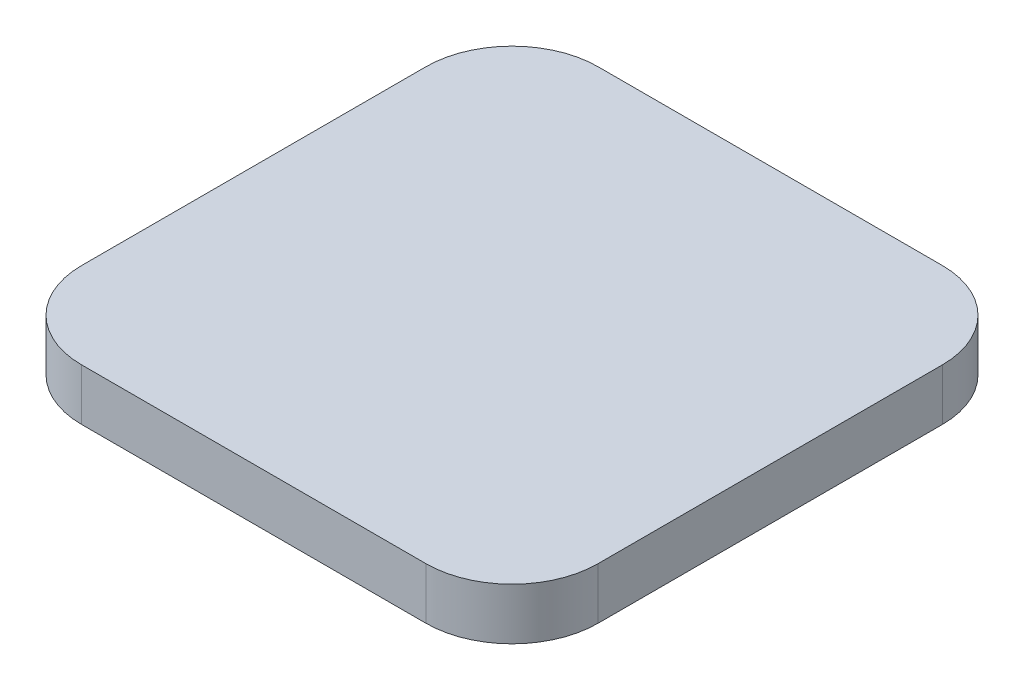
ISO-10303-21;
HEADER;
FILE_DESCRIPTION(('STEP AP214'),'2;1');
FILE_NAME('part.step','',(''),(''),'','','');
FILE_SCHEMA(('AUTOMOTIVE_DESIGN { 1 0 10303 214 1 1 1 1 }'));
ENDSEC;
DATA;
#1=APPLICATION_CONTEXT('core data for automotive mechanical design processes');
#2=APPLICATION_PROTOCOL_DEFINITION('international standard','automotive_design',2000,#1);
#3=PRODUCT_CONTEXT('',#1,'mechanical');
#4=PRODUCT('Part','Part','',(#3));
#5=PRODUCT_RELATED_PRODUCT_CATEGORY('part','',(#4));
#6=PRODUCT_DEFINITION_FORMATION('','',#4);
#7=PRODUCT_DEFINITION_CONTEXT('part definition',#1,'design');
#8=PRODUCT_DEFINITION('design','',#6,#7);
#9=PRODUCT_DEFINITION_SHAPE('','',#8);
#10=(LENGTH_UNIT() NAMED_UNIT(*) SI_UNIT(.MILLI.,.METRE.));
#11=(NAMED_UNIT(*) PLANE_ANGLE_UNIT() SI_UNIT($,.RADIAN.));
#12=(NAMED_UNIT(*) SI_UNIT($,.STERADIAN.) SOLID_ANGLE_UNIT());
#13=UNCERTAINTY_MEASURE_WITH_UNIT(LENGTH_MEASURE(1.E-05),#10,'distance_accuracy_value','');
#14=(GEOMETRIC_REPRESENTATION_CONTEXT(3) GLOBAL_UNCERTAINTY_ASSIGNED_CONTEXT((#13)) GLOBAL_UNIT_ASSIGNED_CONTEXT((#10,
#11,#12)) REPRESENTATION_CONTEXT('',''));
#15=CARTESIAN_POINT('',(0.,0.,0.));
#16=DIRECTION('',(0.,0.,1.));
#17=DIRECTION('',(1.,0.,0.));
#18=AXIS2_PLACEMENT_3D('',#15,#16,#17);
#19=CARTESIAN_POINT('',(-9.99999999999999,3.,10.));
#20=DIRECTION('',(0.,-1.,0.));
#21=DIRECTION('',(0.,0.,-1.));
#22=AXIS2_PLACEMENT_3D('',#19,#20,#21);
#23=CYLINDRICAL_SURFACE('',#22,5.);
#24=CARTESIAN_POINT('',(-9.99999999999999,0.,10.));
#25=DIRECTION('',(0.,1.,0.));
#26=DIRECTION('',(0.,0.,-1.));
#27=AXIS2_PLACEMENT_3D('',#24,#25,#26);
#28=CIRCLE('',#27,5.);
#29=CARTESIAN_POINT('',(-15.,0.,10.));
#30=VERTEX_POINT('',#29);
#31=CARTESIAN_POINT('',(-9.99999999999999,0.,15.));
#32=VERTEX_POINT('',#31);
#33=EDGE_CURVE('E135',#30,#32,#28,.T.);
#34=ORIENTED_EDGE('',*,*,#33,.T.);
#35=DIRECTION('',(0.,-1.,0.));
#36=VECTOR('',#35,1.);
#37=CARTESIAN_POINT('',(-9.99999999999999,3.,15.));
#38=LINE('',#37,#36);
#39=CARTESIAN_POINT('',(-9.99999999999999,3.,15.));
#40=VERTEX_POINT('',#39);
#41=EDGE_CURVE('E11',#40,#32,#38,.T.);
#42=ORIENTED_EDGE('',*,*,#41,.F.);
#43=CARTESIAN_POINT('',(-9.99999999999999,3.,10.));
#44=DIRECTION('',(0.,1.,0.));
#45=DIRECTION('',(0.,0.,-1.));
#46=AXIS2_PLACEMENT_3D('',#43,#44,#45);
#47=CIRCLE('',#46,5.);
#48=CARTESIAN_POINT('',(-15.,3.,10.));
#49=VERTEX_POINT('',#48);
#50=EDGE_CURVE('E149',#49,#40,#47,.T.);
#51=ORIENTED_EDGE('',*,*,#50,.F.);
#52=DIRECTION('',(0.,-1.,0.));
#53=VECTOR('',#52,1.);
#54=CARTESIAN_POINT('',(-15.,3.,10.));
#55=LINE('',#54,#53);
#56=EDGE_CURVE('E131',#49,#30,#55,.T.);
#57=ORIENTED_EDGE('',*,*,#56,.T.);
#58=EDGE_LOOP('',(#34,#42,#51,#57));
#59=FACE_BOUND('',#58,.T.);
#60=ADVANCED_FACE('F39',(#59),#23,.T.);
#61=CARTESIAN_POINT('',(-9.99999999999999,3.,15.));
#62=DIRECTION('',(0.,0.,-1.));
#63=DIRECTION('',(-1.,0.,0.));
#64=AXIS2_PLACEMENT_3D('',#61,#62,#63);
#65=PLANE('',#64);
#66=DIRECTION('',(1.,0.,0.));
#67=VECTOR('',#66,1.);
#68=CARTESIAN_POINT('',(-9.99999999999999,0.,15.));
#69=LINE('',#68,#67);
#70=CARTESIAN_POINT('',(10.,0.,15.));
#71=VERTEX_POINT('',#70);
#72=EDGE_CURVE('E138',#32,#71,#69,.T.);
#73=ORIENTED_EDGE('',*,*,#72,.T.);
#74=DIRECTION('',(0.,-1.,0.));
#75=VECTOR('',#74,1.);
#76=CARTESIAN_POINT('',(10.,3.,15.));
#77=LINE('',#76,#75);
#78=CARTESIAN_POINT('',(10.,3.,15.));
#79=VERTEX_POINT('',#78);
#80=EDGE_CURVE('E47',#79,#71,#77,.T.);
#81=ORIENTED_EDGE('',*,*,#80,.F.);
#82=DIRECTION('',(1.,0.,0.));
#83=VECTOR('',#82,1.);
#84=CARTESIAN_POINT('',(-9.99999999999999,3.,15.));
#85=LINE('',#84,#83);
#86=EDGE_CURVE('E98',#40,#79,#85,.T.);
#87=ORIENTED_EDGE('',*,*,#86,.F.);
#88=ORIENTED_EDGE('',*,*,#41,.T.);
#89=EDGE_LOOP('',(#73,#81,#87,#88));
#90=FACE_BOUND('',#89,.T.);
#91=ADVANCED_FACE('F184',(#90),#65,.F.);
#92=CARTESIAN_POINT('',(10.,3.,10.));
#93=DIRECTION('',(0.,-1.,0.));
#94=DIRECTION('',(0.,0.,-1.));
#95=AXIS2_PLACEMENT_3D('',#92,#93,#94);
#96=CYLINDRICAL_SURFACE('',#95,5.);
#97=CARTESIAN_POINT('',(10.,0.,10.));
#98=DIRECTION('',(0.,1.,0.));
#99=DIRECTION('',(0.,0.,1.));
#100=AXIS2_PLACEMENT_3D('',#97,#98,#99);
#101=CIRCLE('',#100,5.);
#102=CARTESIAN_POINT('',(15.,0.,10.));
#103=VERTEX_POINT('',#102);
#104=EDGE_CURVE('E140',#71,#103,#101,.T.);
#105=ORIENTED_EDGE('',*,*,#104,.T.);
#106=DIRECTION('',(0.,-1.,0.));
#107=VECTOR('',#106,1.);
#108=CARTESIAN_POINT('',(15.,3.,10.));
#109=LINE('',#108,#107);
#110=CARTESIAN_POINT('',(15.,3.,10.));
#111=VERTEX_POINT('',#110);
#112=EDGE_CURVE('E156',#111,#103,#109,.T.);
#113=ORIENTED_EDGE('',*,*,#112,.F.);
#114=CARTESIAN_POINT('',(10.,3.,10.));
#115=DIRECTION('',(0.,1.,0.));
#116=DIRECTION('',(0.,0.,1.));
#117=AXIS2_PLACEMENT_3D('',#114,#115,#116);
#118=CIRCLE('',#117,5.);
#119=EDGE_CURVE('E164',#79,#111,#118,.T.);
#120=ORIENTED_EDGE('',*,*,#119,.F.);
#121=ORIENTED_EDGE('',*,*,#80,.T.);
#122=EDGE_LOOP('',(#105,#113,#120,#121));
#123=FACE_BOUND('',#122,.T.);
#124=ADVANCED_FACE('F162',(#123),#96,.T.);
#125=CARTESIAN_POINT('',(15.,3.,10.));
#126=DIRECTION('',(-1.,0.,0.));
#127=DIRECTION('',(0.,0.,1.));
#128=AXIS2_PLACEMENT_3D('',#125,#126,#127);
#129=PLANE('',#128);
#130=DIRECTION('',(0.,0.,-1.));
#131=VECTOR('',#130,1.);
#132=CARTESIAN_POINT('',(15.,0.,10.));
#133=LINE('',#132,#131);
#134=CARTESIAN_POINT('',(15.,0.,-10.));
#135=VERTEX_POINT('',#134);
#136=EDGE_CURVE('E142',#103,#135,#133,.T.);
#137=ORIENTED_EDGE('',*,*,#136,.T.);
#138=DIRECTION('',(0.,-1.,0.));
#139=VECTOR('',#138,1.);
#140=CARTESIAN_POINT('',(15.,3.,-10.));
#141=LINE('',#140,#139);
#142=CARTESIAN_POINT('',(15.,3.,-10.));
#143=VERTEX_POINT('',#142);
#144=EDGE_CURVE('E153',#143,#135,#141,.T.);
#145=ORIENTED_EDGE('',*,*,#144,.F.);
#146=DIRECTION('',(0.,0.,-1.));
#147=VECTOR('',#146,1.);
#148=CARTESIAN_POINT('',(15.,3.,10.));
#149=LINE('',#148,#147);
#150=EDGE_CURVE('E176',#111,#143,#149,.T.);
#151=ORIENTED_EDGE('',*,*,#150,.F.);
#152=ORIENTED_EDGE('',*,*,#112,.T.);
#153=EDGE_LOOP('',(#137,#145,#151,#152));
#154=FACE_BOUND('',#153,.T.);
#155=ADVANCED_FACE('F172',(#154),#129,.F.);
#156=CARTESIAN_POINT('',(10.,3.,-10.));
#157=DIRECTION('',(0.,-1.,0.));
#158=DIRECTION('',(0.,0.,-1.));
#159=AXIS2_PLACEMENT_3D('',#156,#157,#158);
#160=CYLINDRICAL_SURFACE('',#159,5.);
#161=CARTESIAN_POINT('',(10.,0.,-10.));
#162=DIRECTION('',(0.,1.,0.));
#163=DIRECTION('',(0.,0.,-1.));
#164=AXIS2_PLACEMENT_3D('',#161,#162,#163);
#165=CIRCLE('',#164,5.);
#166=CARTESIAN_POINT('',(10.,0.,-15.));
#167=VERTEX_POINT('',#166);
#168=EDGE_CURVE('E144',#135,#167,#165,.T.);
#169=ORIENTED_EDGE('',*,*,#168,.T.);
#170=DIRECTION('',(0.,-1.,0.));
#171=VECTOR('',#170,1.);
#172=CARTESIAN_POINT('',(10.,3.,-15.));
#173=LINE('',#172,#171);
#174=CARTESIAN_POINT('',(10.,3.,-15.));
#175=VERTEX_POINT('',#174);
#176=EDGE_CURVE('E126',#175,#167,#173,.T.);
#177=ORIENTED_EDGE('',*,*,#176,.F.);
#178=CARTESIAN_POINT('',(10.,3.,-10.));
#179=DIRECTION('',(0.,1.,0.));
#180=DIRECTION('',(0.,0.,-1.));
#181=AXIS2_PLACEMENT_3D('',#178,#179,#180);
#182=CIRCLE('',#181,5.);
#183=EDGE_CURVE('E117',#143,#175,#182,.T.);
#184=ORIENTED_EDGE('',*,*,#183,.F.);
#185=ORIENTED_EDGE('',*,*,#144,.T.);
#186=EDGE_LOOP('',(#169,#177,#184,#185));
#187=FACE_BOUND('',#186,.T.);
#188=ADVANCED_FACE('F175',(#187),#160,.T.);
#189=CARTESIAN_POINT('',(-10.,3.,-15.));
#190=DIRECTION('',(0.,0.,1.));
#191=DIRECTION('',(1.,0.,0.));
#192=AXIS2_PLACEMENT_3D('',#189,#190,#191);
#193=PLANE('',#192);
#194=DIRECTION('',(-1.,0.,0.));
#195=VECTOR('',#194,1.);
#196=CARTESIAN_POINT('',(-10.,0.,-15.));
#197=LINE('',#196,#195);
#198=CARTESIAN_POINT('',(-10.,0.,-15.));
#199=VERTEX_POINT('',#198);
#200=EDGE_CURVE('E125',#167,#199,#197,.T.);
#201=ORIENTED_EDGE('',*,*,#200,.T.);
#202=DIRECTION('',(0.,-1.,0.));
#203=VECTOR('',#202,1.);
#204=CARTESIAN_POINT('',(-10.,3.,-15.));
#205=LINE('',#204,#203);
#206=CARTESIAN_POINT('',(-10.,3.,-15.));
#207=VERTEX_POINT('',#206);
#208=EDGE_CURVE('E122',#207,#199,#205,.T.);
#209=ORIENTED_EDGE('',*,*,#208,.F.);
#210=DIRECTION('',(-1.,0.,0.));
#211=VECTOR('',#210,1.);
#212=CARTESIAN_POINT('',(-10.,3.,-15.));
#213=LINE('',#212,#211);
#214=EDGE_CURVE('E111',#175,#207,#213,.T.);
#215=ORIENTED_EDGE('',*,*,#214,.F.);
#216=ORIENTED_EDGE('',*,*,#176,.T.);
#217=EDGE_LOOP('',(#201,#209,#215,#216));
#218=FACE_BOUND('',#217,.T.);
#219=ADVANCED_FACE('F123',(#218),#193,.F.);
#220=CARTESIAN_POINT('',(-10.,3.,-10.));
#221=DIRECTION('',(0.,-1.,0.));
#222=DIRECTION('',(0.,0.,-1.));
#223=AXIS2_PLACEMENT_3D('',#220,#221,#222);
#224=CYLINDRICAL_SURFACE('',#223,5.);
#225=CARTESIAN_POINT('',(-10.,0.,-10.));
#226=DIRECTION('',(0.,1.,0.));
#227=DIRECTION('',(0.,0.,-1.));
#228=AXIS2_PLACEMENT_3D('',#225,#226,#227);
#229=CIRCLE('',#228,5.);
#230=CARTESIAN_POINT('',(-15.,0.,-10.));
#231=VERTEX_POINT('',#230);
#232=EDGE_CURVE('E84',#199,#231,#229,.T.);
#233=ORIENTED_EDGE('',*,*,#232,.T.);
#234=DIRECTION('',(0.,-1.,0.));
#235=VECTOR('',#234,1.);
#236=CARTESIAN_POINT('',(-15.,3.,-10.));
#237=LINE('',#236,#235);
#238=CARTESIAN_POINT('',(-15.,3.,-10.));
#239=VERTEX_POINT('',#238);
#240=EDGE_CURVE('E127',#239,#231,#237,.T.);
#241=ORIENTED_EDGE('',*,*,#240,.F.);
#242=CARTESIAN_POINT('',(-10.,3.,-10.));
#243=DIRECTION('',(0.,1.,0.));
#244=DIRECTION('',(0.,0.,-1.));
#245=AXIS2_PLACEMENT_3D('',#242,#243,#244);
#246=CIRCLE('',#245,5.);
#247=EDGE_CURVE('E115',#207,#239,#246,.T.);
#248=ORIENTED_EDGE('',*,*,#247,.F.);
#249=ORIENTED_EDGE('',*,*,#208,.T.);
#250=EDGE_LOOP('',(#233,#241,#248,#249));
#251=FACE_BOUND('',#250,.T.);
#252=ADVANCED_FACE('F129',(#251),#224,.T.);
#253=CARTESIAN_POINT('',(-15.,3.,10.));
#254=DIRECTION('',(1.,0.,0.));
#255=DIRECTION('',(0.,0.,-1.));
#256=AXIS2_PLACEMENT_3D('',#253,#254,#255);
#257=PLANE('',#256);
#258=DIRECTION('',(0.,0.,1.));
#259=VECTOR('',#258,1.);
#260=CARTESIAN_POINT('',(-15.,0.,10.));
#261=LINE('',#260,#259);
#262=EDGE_CURVE('E90',#231,#30,#261,.T.);
#263=ORIENTED_EDGE('',*,*,#262,.T.);
#264=ORIENTED_EDGE('',*,*,#56,.F.);
#265=DIRECTION('',(0.,0.,1.));
#266=VECTOR('',#265,1.);
#267=CARTESIAN_POINT('',(-15.,3.,10.));
#268=LINE('',#267,#266);
#269=EDGE_CURVE('E55',#239,#49,#268,.T.);
#270=ORIENTED_EDGE('',*,*,#269,.F.);
#271=ORIENTED_EDGE('',*,*,#240,.T.);
#272=EDGE_LOOP('',(#263,#264,#270,#271));
#273=FACE_BOUND('',#272,.T.);
#274=ADVANCED_FACE('F200',(#273),#257,.F.);
#275=CARTESIAN_POINT('',(-9.99999999999999,3.,10.));
#276=DIRECTION('',(0.,-1.,0.));
#277=DIRECTION('',(0.,0.,-1.));
#278=AXIS2_PLACEMENT_3D('',#275,#276,#277);
#279=PLANE('',#278);
#280=ORIENTED_EDGE('',*,*,#50,.T.);
#281=ORIENTED_EDGE('',*,*,#86,.T.);
#282=ORIENTED_EDGE('',*,*,#119,.T.);
#283=ORIENTED_EDGE('',*,*,#150,.T.);
#284=ORIENTED_EDGE('',*,*,#183,.T.);
#285=ORIENTED_EDGE('',*,*,#214,.T.);
#286=ORIENTED_EDGE('',*,*,#247,.T.);
#287=ORIENTED_EDGE('',*,*,#269,.T.);
#288=EDGE_LOOP('',(#280,#281,#282,#283,#284,#285,#286,#287));
#289=FACE_BOUND('',#288,.T.);
#290=ADVANCED_FACE('F113',(#289),#279,.F.);
#291=CARTESIAN_POINT('',(-9.99999999999999,0.,10.));
#292=DIRECTION('',(0.,-1.,0.));
#293=DIRECTION('',(0.,0.,-1.));
#294=AXIS2_PLACEMENT_3D('',#291,#292,#293);
#295=PLANE('',#294);
#296=ORIENTED_EDGE('',*,*,#33,.F.);
#297=ORIENTED_EDGE('',*,*,#262,.F.);
#298=ORIENTED_EDGE('',*,*,#232,.F.);
#299=ORIENTED_EDGE('',*,*,#200,.F.);
#300=ORIENTED_EDGE('',*,*,#168,.F.);
#301=ORIENTED_EDGE('',*,*,#136,.F.);
#302=ORIENTED_EDGE('',*,*,#104,.F.);
#303=ORIENTED_EDGE('',*,*,#72,.F.);
#304=EDGE_LOOP('',(#296,#297,#298,#299,#300,#301,#302,#303));
#305=FACE_BOUND('',#304,.T.);
#306=ADVANCED_FACE('F168',(#305),#295,.T.);
#307=CLOSED_SHELL('',(#60,#91,#124,#155,#188,#219,#252,#274,#290,#306));
#308=MANIFOLD_SOLID_BREP('B2',#307);
#309=ADVANCED_BREP_SHAPE_REPRESENTATION('',(#18,#308),#14);
#310=SHAPE_DEFINITION_REPRESENTATION(#9,#309);
ENDSEC;
END-ISO-10303-21;
